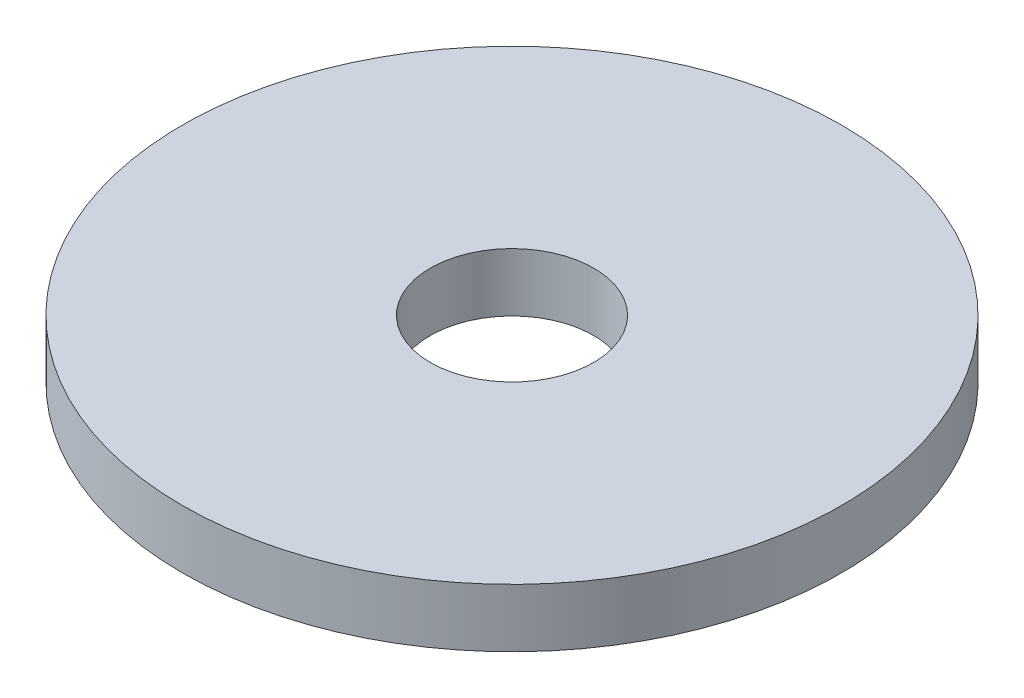
ISO-10303-21;
HEADER;
FILE_DESCRIPTION(('STEP AP214'),'2;1');
FILE_NAME('part.step','',(''),(''),'','','');
FILE_SCHEMA(('AUTOMOTIVE_DESIGN { 1 0 10303 214 1 1 1 1 }'));
ENDSEC;
DATA;
#1=APPLICATION_CONTEXT('core data for automotive mechanical design processes');
#2=APPLICATION_PROTOCOL_DEFINITION('international standard','automotive_design',2000,#1);
#3=PRODUCT_CONTEXT('',#1,'mechanical');
#4=PRODUCT('Part','Part','',(#3));
#5=PRODUCT_RELATED_PRODUCT_CATEGORY('part','',(#4));
#6=PRODUCT_DEFINITION_FORMATION('','',#4);
#7=PRODUCT_DEFINITION_CONTEXT('part definition',#1,'design');
#8=PRODUCT_DEFINITION('design','',#6,#7);
#9=PRODUCT_DEFINITION_SHAPE('','',#8);
#10=(LENGTH_UNIT() NAMED_UNIT(*) SI_UNIT(.MILLI.,.METRE.));
#11=(NAMED_UNIT(*) PLANE_ANGLE_UNIT() SI_UNIT($,.RADIAN.));
#12=(NAMED_UNIT(*) SI_UNIT($,.STERADIAN.) SOLID_ANGLE_UNIT());
#13=UNCERTAINTY_MEASURE_WITH_UNIT(LENGTH_MEASURE(1.E-05),#10,'distance_accuracy_value','');
#14=(GEOMETRIC_REPRESENTATION_CONTEXT(3) GLOBAL_UNCERTAINTY_ASSIGNED_CONTEXT((#13)) GLOBAL_UNIT_ASSIGNED_CONTEXT((#10,
#11,#12)) REPRESENTATION_CONTEXT('',''));
#15=CARTESIAN_POINT('',(0.,0.,0.));
#16=DIRECTION('',(0.,0.,1.));
#17=DIRECTION('',(1.,0.,0.));
#18=AXIS2_PLACEMENT_3D('',#15,#16,#17);
#19=CARTESIAN_POINT('',(0.,4.749998628,0.));
#20=DIRECTION('',(0.,-1.,0.));
#21=DIRECTION('',(0.,0.,-1.));
#22=AXIS2_PLACEMENT_3D('',#19,#20,#21);
#23=CYLINDRICAL_SURFACE('',#22,4.2333418);
#24=CARTESIAN_POINT('',(0.,4.749998628,0.));
#25=DIRECTION('',(0.,1.,0.));
#26=DIRECTION('',(0.,0.,1.));
#27=AXIS2_PLACEMENT_3D('',#24,#25,#26);
#28=CIRCLE('',#27,4.2333418);
#29=CARTESIAN_POINT('',(0.,4.749998628,4.2333418));
#30=VERTEX_POINT('',#29);
#31=EDGE_CURVE('E10',#30,#30,#28,.T.);
#32=ORIENTED_EDGE('',*,*,#31,.F.);
#33=EDGE_LOOP('',(#32));
#34=FACE_BOUND('',#33,.T.);
#35=CARTESIAN_POINT('',(0.,4.000000128,0.));
#36=DIRECTION('',(0.,1.,0.));
#37=DIRECTION('',(0.,0.,1.));
#38=AXIS2_PLACEMENT_3D('',#35,#36,#37);
#39=CIRCLE('',#38,4.2333418);
#40=CARTESIAN_POINT('',(0.,4.000000128,4.2333418));
#41=VERTEX_POINT('',#40);
#42=EDGE_CURVE('E57',#41,#41,#39,.T.);
#43=ORIENTED_EDGE('',*,*,#42,.T.);
#44=EDGE_LOOP('',(#43));
#45=FACE_BOUND('',#44,.T.);
#46=ADVANCED_FACE('F49',(#34,#45),#23,.T.);
#47=CARTESIAN_POINT('',(0.,4.749998628,0.));
#48=DIRECTION('',(0.,1.,0.));
#49=DIRECTION('',(0.,0.,1.));
#50=AXIS2_PLACEMENT_3D('',#47,#48,#49);
#51=PLANE('',#50);
#52=CARTESIAN_POINT('',(0.,4.749998628,0.));
#53=DIRECTION('',(0.,1.,0.));
#54=DIRECTION('',(0.,0.,1.));
#55=AXIS2_PLACEMENT_3D('',#52,#53,#54);
#56=CIRCLE('',#55,1.05);
#57=CARTESIAN_POINT('',(0.,4.749998628,1.05));
#58=VERTEX_POINT('',#57);
#59=EDGE_CURVE('E63',#58,#58,#56,.T.);
#60=ORIENTED_EDGE('',*,*,#59,.F.);
#61=EDGE_LOOP('',(#60));
#62=FACE_BOUND('',#61,.T.);
#63=ORIENTED_EDGE('',*,*,#31,.T.);
#64=EDGE_LOOP('',(#63));
#65=FACE_BOUND('',#64,.T.);
#66=ADVANCED_FACE('F77',(#62,#65),#51,.T.);
#67=CARTESIAN_POINT('',(0.,4.000000128,0.));
#68=DIRECTION('',(0.,1.,0.));
#69=DIRECTION('',(0.,0.,1.));
#70=AXIS2_PLACEMENT_3D('',#67,#68,#69);
#71=PLANE('',#70);
#72=ORIENTED_EDGE('',*,*,#42,.F.);
#73=EDGE_LOOP('',(#72));
#74=FACE_BOUND('',#73,.T.);
#75=CARTESIAN_POINT('',(0.,4.000000128,0.));
#76=DIRECTION('',(0.,1.,0.));
#77=DIRECTION('',(0.,0.,1.));
#78=AXIS2_PLACEMENT_3D('',#75,#76,#77);
#79=CIRCLE('',#78,1.05);
#80=CARTESIAN_POINT('',(0.,4.000000128,1.05));
#81=VERTEX_POINT('',#80);
#82=EDGE_CURVE('E52',#81,#81,#79,.F.);
#83=ORIENTED_EDGE('',*,*,#82,.F.);
#84=EDGE_LOOP('',(#83));
#85=FACE_BOUND('',#84,.T.);
#86=ADVANCED_FACE('F75',(#74,#85),#71,.F.);
#87=CARTESIAN_POINT('',(0.,0.,0.));
#88=DIRECTION('',(0.,1.,0.));
#89=DIRECTION('',(0.,0.,1.));
#90=AXIS2_PLACEMENT_3D('',#87,#88,#89);
#91=CYLINDRICAL_SURFACE('',#90,1.05);
#92=ORIENTED_EDGE('',*,*,#82,.T.);
#93=EDGE_LOOP('',(#92));
#94=FACE_BOUND('',#93,.T.);
#95=ORIENTED_EDGE('',*,*,#59,.T.);
#96=EDGE_LOOP('',(#95));
#97=FACE_BOUND('',#96,.T.);
#98=ADVANCED_FACE('F73',(#94,#97),#91,.F.);
#99=CLOSED_SHELL('',(#46,#66,#86,#98));
#100=MANIFOLD_SOLID_BREP('B2',#99);
#101=ADVANCED_BREP_SHAPE_REPRESENTATION('',(#18,#100),#14);
#102=SHAPE_DEFINITION_REPRESENTATION(#9,#101);
ENDSEC;
END-ISO-10303-21;
